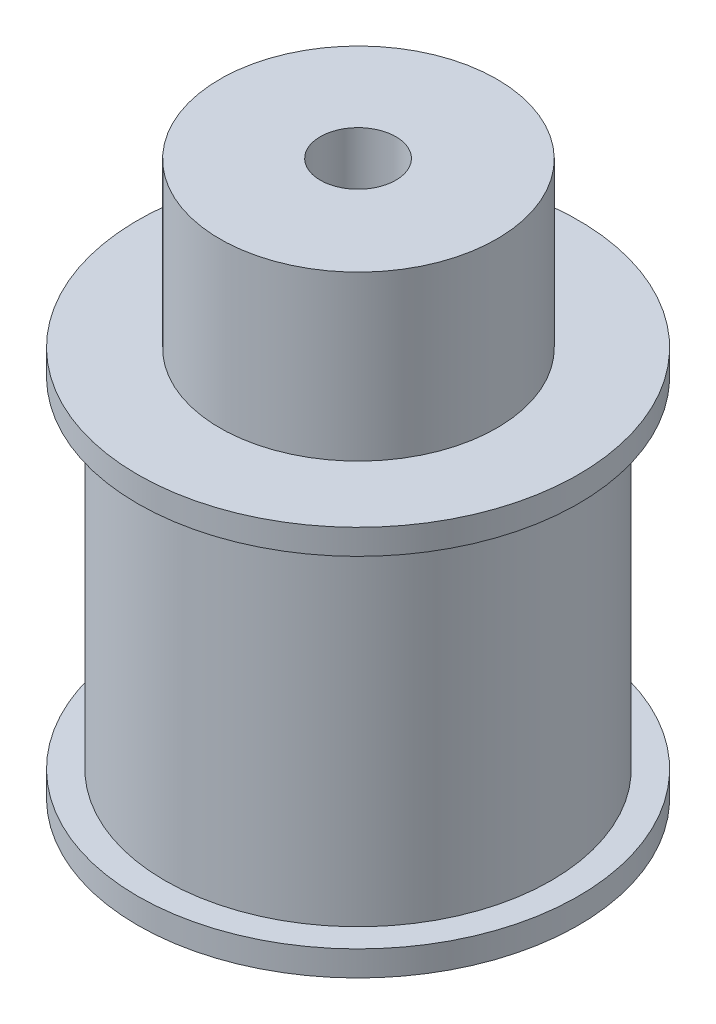
ISO-10303-21;
HEADER;
FILE_DESCRIPTION(('STEP AP214'),'2;1');
FILE_NAME('part.step','',(''),(''),'','','');
FILE_SCHEMA(('AUTOMOTIVE_DESIGN { 1 0 10303 214 1 1 1 1 }'));
ENDSEC;
DATA;
#1=APPLICATION_CONTEXT('core data for automotive mechanical design processes');
#2=APPLICATION_PROTOCOL_DEFINITION('international standard','automotive_design',2000,#1);
#3=PRODUCT_CONTEXT('',#1,'mechanical');
#4=PRODUCT('Part','Part','',(#3));
#5=PRODUCT_RELATED_PRODUCT_CATEGORY('part','',(#4));
#6=PRODUCT_DEFINITION_FORMATION('','',#4);
#7=PRODUCT_DEFINITION_CONTEXT('part definition',#1,'design');
#8=PRODUCT_DEFINITION('design','',#6,#7);
#9=PRODUCT_DEFINITION_SHAPE('','',#8);
#10=(LENGTH_UNIT() NAMED_UNIT(*) SI_UNIT(.MILLI.,.METRE.));
#11=(NAMED_UNIT(*) PLANE_ANGLE_UNIT() SI_UNIT($,.RADIAN.));
#12=(NAMED_UNIT(*) SI_UNIT($,.STERADIAN.) SOLID_ANGLE_UNIT());
#13=UNCERTAINTY_MEASURE_WITH_UNIT(LENGTH_MEASURE(1.E-05),#10,'distance_accuracy_value','');
#14=(GEOMETRIC_REPRESENTATION_CONTEXT(3) GLOBAL_UNCERTAINTY_ASSIGNED_CONTEXT((#13)) GLOBAL_UNIT_ASSIGNED_CONTEXT((#10,
#11,#12)) REPRESENTATION_CONTEXT('',''));
#15=CARTESIAN_POINT('',(0.,0.,0.));
#16=DIRECTION('',(0.,0.,1.));
#17=DIRECTION('',(1.,0.,0.));
#18=AXIS2_PLACEMENT_3D('',#15,#16,#17);
#19=CARTESIAN_POINT('',(0.,13.5,0.));
#20=DIRECTION('',(0.,-1.,0.));
#21=DIRECTION('',(0.,0.,-1.));
#22=AXIS2_PLACEMENT_3D('',#19,#20,#21);
#23=CYLINDRICAL_SURFACE('',#22,15.345);
#24=CARTESIAN_POINT('',(0.,13.5,0.));
#25=DIRECTION('',(0.,1.,0.));
#26=DIRECTION('',(0.,0.,1.));
#27=AXIS2_PLACEMENT_3D('',#24,#25,#26);
#28=CIRCLE('',#27,15.345);
#29=CARTESIAN_POINT('',(0.,13.5,15.345));
#30=VERTEX_POINT('',#29);
#31=EDGE_CURVE('E48',#30,#30,#28,.T.);
#32=ORIENTED_EDGE('',*,*,#31,.F.);
#33=EDGE_LOOP('',(#32));
#34=FACE_BOUND('',#33,.T.);
#35=CARTESIAN_POINT('',(0.,-13.5,0.));
#36=DIRECTION('',(0.,1.,0.));
#37=DIRECTION('',(0.,0.,1.));
#38=AXIS2_PLACEMENT_3D('',#35,#36,#37);
#39=CIRCLE('',#38,15.345);
#40=CARTESIAN_POINT('',(0.,-13.5,15.345));
#41=VERTEX_POINT('',#40);
#42=EDGE_CURVE('E44',#41,#41,#39,.T.);
#43=ORIENTED_EDGE('',*,*,#42,.T.);
#44=EDGE_LOOP('',(#43));
#45=FACE_BOUND('',#44,.T.);
#46=ADVANCED_FACE('F41',(#34,#45),#23,.T.);
#47=CARTESIAN_POINT('',(0.,15.5,0.));
#48=DIRECTION('',(0.,-1.,0.));
#49=DIRECTION('',(0.,0.,-1.));
#50=AXIS2_PLACEMENT_3D('',#47,#48,#49);
#51=CYLINDRICAL_SURFACE('',#50,17.5);
#52=CARTESIAN_POINT('',(0.,15.5,0.));
#53=DIRECTION('',(0.,1.,0.));
#54=DIRECTION('',(0.,0.,1.));
#55=AXIS2_PLACEMENT_3D('',#52,#53,#54);
#56=CIRCLE('',#55,17.5);
#57=CARTESIAN_POINT('',(0.,15.5,17.5));
#58=VERTEX_POINT('',#57);
#59=EDGE_CURVE('E53',#58,#58,#56,.T.);
#60=ORIENTED_EDGE('',*,*,#59,.F.);
#61=EDGE_LOOP('',(#60));
#62=FACE_BOUND('',#61,.T.);
#63=CARTESIAN_POINT('',(0.,13.5,0.));
#64=DIRECTION('',(0.,1.,0.));
#65=DIRECTION('',(0.,0.,1.));
#66=AXIS2_PLACEMENT_3D('',#63,#64,#65);
#67=CIRCLE('',#66,17.5);
#68=CARTESIAN_POINT('',(0.,13.5,17.5));
#69=VERTEX_POINT('',#68);
#70=EDGE_CURVE('E66',#69,#69,#67,.T.);
#71=ORIENTED_EDGE('',*,*,#70,.T.);
#72=EDGE_LOOP('',(#71));
#73=FACE_BOUND('',#72,.T.);
#74=ADVANCED_FACE('F98',(#62,#73),#51,.T.);
#75=CARTESIAN_POINT('',(0.,15.5,0.));
#76=DIRECTION('',(0.,1.,0.));
#77=DIRECTION('',(0.,0.,1.));
#78=AXIS2_PLACEMENT_3D('',#75,#76,#77);
#79=PLANE('',#78);
#80=CARTESIAN_POINT('',(0.0580145033387731,15.5,0.0291708459255628));
#81=DIRECTION('',(0.,1.,0.));
#82=DIRECTION('',(0.,0.,1.));
#83=AXIS2_PLACEMENT_3D('',#80,#81,#82);
#84=CIRCLE('',#83,11.);
#85=CARTESIAN_POINT('',(0.0580145033387731,15.5,-10.9708291540744));
#86=VERTEX_POINT('',#85);
#87=EDGE_CURVE('E10',#86,#86,#84,.T.);
#88=ORIENTED_EDGE('',*,*,#87,.F.);
#89=EDGE_LOOP('',(#88));
#90=FACE_BOUND('',#89,.T.);
#91=ORIENTED_EDGE('',*,*,#59,.T.);
#92=EDGE_LOOP('',(#91));
#93=FACE_BOUND('',#92,.T.);
#94=ADVANCED_FACE('F93',(#90,#93),#79,.T.);
#95=CARTESIAN_POINT('',(0.,13.5,0.));
#96=DIRECTION('',(0.,1.,0.));
#97=DIRECTION('',(0.,0.,1.));
#98=AXIS2_PLACEMENT_3D('',#95,#96,#97);
#99=PLANE('',#98);
#100=ORIENTED_EDGE('',*,*,#31,.T.);
#101=EDGE_LOOP('',(#100));
#102=FACE_BOUND('',#101,.T.);
#103=ORIENTED_EDGE('',*,*,#70,.F.);
#104=EDGE_LOOP('',(#103));
#105=FACE_BOUND('',#104,.T.);
#106=ADVANCED_FACE('F84',(#102,#105),#99,.F.);
#107=CARTESIAN_POINT('',(0.,-15.5,0.));
#108=DIRECTION('',(0.,1.,0.));
#109=DIRECTION('',(0.,0.,1.));
#110=AXIS2_PLACEMENT_3D('',#107,#108,#109);
#111=CYLINDRICAL_SURFACE('',#110,17.5);
#112=CARTESIAN_POINT('',(0.,-15.5,0.));
#113=DIRECTION('',(0.,1.,0.));
#114=DIRECTION('',(0.,0.,1.));
#115=AXIS2_PLACEMENT_3D('',#112,#113,#114);
#116=CIRCLE('',#115,17.5);
#117=CARTESIAN_POINT('',(0.,-15.5,17.5));
#118=VERTEX_POINT('',#117);
#119=EDGE_CURVE('E58',#118,#118,#116,.T.);
#120=ORIENTED_EDGE('',*,*,#119,.T.);
#121=EDGE_LOOP('',(#120));
#122=FACE_BOUND('',#121,.T.);
#123=CARTESIAN_POINT('',(0.,-13.5,0.));
#124=DIRECTION('',(0.,1.,0.));
#125=DIRECTION('',(0.,0.,1.));
#126=AXIS2_PLACEMENT_3D('',#123,#124,#125);
#127=CIRCLE('',#126,17.5);
#128=CARTESIAN_POINT('',(0.,-13.5,17.5));
#129=VERTEX_POINT('',#128);
#130=EDGE_CURVE('E61',#129,#129,#127,.T.);
#131=ORIENTED_EDGE('',*,*,#130,.F.);
#132=EDGE_LOOP('',(#131));
#133=FACE_BOUND('',#132,.T.);
#134=ADVANCED_FACE('F82',(#122,#133),#111,.T.);
#135=CARTESIAN_POINT('',(0.,-15.5,0.));
#136=DIRECTION('',(0.,-1.,0.));
#137=DIRECTION('',(0.,0.,1.));
#138=AXIS2_PLACEMENT_3D('',#135,#136,#137);
#139=PLANE('',#138);
#140=CARTESIAN_POINT('',(0.,-15.5,0.));
#141=DIRECTION('',(0.,1.,0.));
#142=DIRECTION('',(0.,0.,1.));
#143=AXIS2_PLACEMENT_3D('',#140,#141,#142);
#144=CIRCLE('',#143,3.);
#145=CARTESIAN_POINT('',(0.,-15.5,3.));
#146=VERTEX_POINT('',#145);
#147=EDGE_CURVE('E183',#146,#146,#144,.T.);
#148=ORIENTED_EDGE('',*,*,#147,.T.);
#149=EDGE_LOOP('',(#148));
#150=FACE_BOUND('',#149,.T.);
#151=ORIENTED_EDGE('',*,*,#119,.F.);
#152=EDGE_LOOP('',(#151));
#153=FACE_BOUND('',#152,.T.);
#154=ADVANCED_FACE('F78',(#150,#153),#139,.T.);
#155=CARTESIAN_POINT('',(0.,-13.5,0.));
#156=DIRECTION('',(0.,-1.,0.));
#157=DIRECTION('',(0.,0.,1.));
#158=AXIS2_PLACEMENT_3D('',#155,#156,#157);
#159=PLANE('',#158);
#160=ORIENTED_EDGE('',*,*,#42,.F.);
#161=EDGE_LOOP('',(#160));
#162=FACE_BOUND('',#161,.T.);
#163=ORIENTED_EDGE('',*,*,#130,.T.);
#164=EDGE_LOOP('',(#163));
#165=FACE_BOUND('',#164,.T.);
#166=ADVANCED_FACE('F74',(#162,#165),#159,.F.);
#167=CARTESIAN_POINT('',(0.0580145033387731,28.5,0.0291708459255628));
#168=DIRECTION('',(0.,-1.,0.));
#169=DIRECTION('',(0.,0.,-1.));
#170=AXIS2_PLACEMENT_3D('',#167,#168,#169);
#171=CYLINDRICAL_SURFACE('',#170,11.);
#172=CARTESIAN_POINT('',(0.0580145033387731,28.5,0.0291708459255628));
#173=DIRECTION('',(0.,1.,0.));
#174=DIRECTION('',(0.,0.,1.));
#175=AXIS2_PLACEMENT_3D('',#172,#173,#174);
#176=CIRCLE('',#175,11.);
#177=CARTESIAN_POINT('',(0.0580145033387731,28.5,-10.9708291540744));
#178=VERTEX_POINT('',#177);
#179=EDGE_CURVE('E56',#178,#178,#176,.T.);
#180=CARTESIAN_POINT('',(0.0580145033387731,28.5,-10.9708291540744));
#181=CARTESIAN_POINT('',(0.0580145033387731,28.3645833333333,-10.9708291540744));
#182=CARTESIAN_POINT('',(0.0580145033387731,28.2291666666667,-10.9708291540744));
#183=CARTESIAN_POINT('',(0.0580145033387731,27.9583333333333,-10.9708291540744));
#184=CARTESIAN_POINT('',(0.0580145033387731,27.8229166666667,-10.9708291540744));
#185=CARTESIAN_POINT('',(0.0580145033387731,27.5520833333333,-10.9708291540744));
#186=CARTESIAN_POINT('',(0.0580145033387731,27.4166666666667,-10.9708291540744));
#187=CARTESIAN_POINT('',(0.0580145033387731,27.1458333333333,-10.9708291540744));
#188=CARTESIAN_POINT('',(0.0580145033387731,27.0104166666667,-10.9708291540744));
#189=CARTESIAN_POINT('',(0.0580145033387731,26.7395833333333,-10.9708291540744));
#190=CARTESIAN_POINT('',(0.0580145033387731,26.6041666666667,-10.9708291540744));
#191=CARTESIAN_POINT('',(0.0580145033387731,26.3333333333333,-10.9708291540744));
#192=CARTESIAN_POINT('',(0.0580145033387731,26.1979166666667,-10.9708291540744));
#193=CARTESIAN_POINT('',(0.0580145033387731,25.9270833333333,-10.9708291540744));
#194=CARTESIAN_POINT('',(0.0580145033387731,25.7916666666667,-10.9708291540744));
#195=CARTESIAN_POINT('',(0.0580145033387731,25.5208333333333,-10.9708291540744));
#196=CARTESIAN_POINT('',(0.0580145033387731,25.3854166666667,-10.9708291540744));
#197=CARTESIAN_POINT('',(0.0580145033387731,25.1145833333333,-10.9708291540744));
#198=CARTESIAN_POINT('',(0.0580145033387731,24.9791666666667,-10.9708291540744));
#199=CARTESIAN_POINT('',(0.0580145033387731,24.7083333333333,-10.9708291540744));
#200=CARTESIAN_POINT('',(0.0580145033387731,24.5729166666667,-10.9708291540744));
#201=CARTESIAN_POINT('',(0.0580145033387731,24.3020833333333,-10.9708291540744));
#202=CARTESIAN_POINT('',(0.0580145033387731,24.1666666666667,-10.9708291540744));
#203=CARTESIAN_POINT('',(0.0580145033387731,23.8958333333333,-10.9708291540744));
#204=CARTESIAN_POINT('',(0.0580145033387731,23.7604166666667,-10.9708291540744));
#205=CARTESIAN_POINT('',(0.0580145033387731,23.4895833333333,-10.9708291540744));
#206=CARTESIAN_POINT('',(0.0580145033387731,23.3541666666667,-10.9708291540744));
#207=CARTESIAN_POINT('',(0.0580145033387731,23.0833333333333,-10.9708291540744));
#208=CARTESIAN_POINT('',(0.0580145033387731,22.9479166666667,-10.9708291540744));
#209=CARTESIAN_POINT('',(0.0580145033387731,22.6770833333333,-10.9708291540744));
#210=CARTESIAN_POINT('',(0.0580145033387731,22.5416666666667,-10.9708291540744));
#211=CARTESIAN_POINT('',(0.0580145033387731,22.2708333333333,-10.9708291540744));
#212=CARTESIAN_POINT('',(0.0580145033387731,22.1354166666667,-10.9708291540744));
#213=CARTESIAN_POINT('',(0.0580145033387731,21.8645833333333,-10.9708291540744));
#214=CARTESIAN_POINT('',(0.0580145033387731,21.7291666666667,-10.9708291540744));
#215=CARTESIAN_POINT('',(0.0580145033387731,21.4583333333333,-10.9708291540744));
#216=CARTESIAN_POINT('',(0.0580145033387731,21.3229166666667,-10.9708291540744));
#217=CARTESIAN_POINT('',(0.0580145033387731,21.0520833333333,-10.9708291540744));
#218=CARTESIAN_POINT('',(0.0580145033387731,20.9166666666667,-10.9708291540744));
#219=CARTESIAN_POINT('',(0.0580145033387731,20.6458333333333,-10.9708291540744));
#220=CARTESIAN_POINT('',(0.0580145033387731,20.5104166666667,-10.9708291540744));
#221=CARTESIAN_POINT('',(0.0580145033387731,20.2395833333333,-10.9708291540744));
#222=CARTESIAN_POINT('',(0.0580145033387731,20.1041666666667,-10.9708291540744));
#223=CARTESIAN_POINT('',(0.0580145033387731,19.8333333333333,-10.9708291540744));
#224=CARTESIAN_POINT('',(0.0580145033387731,19.6979166666667,-10.9708291540744));
#225=CARTESIAN_POINT('',(0.0580145033387731,19.4270833333333,-10.9708291540744));
#226=CARTESIAN_POINT('',(0.0580145033387731,19.2916666666667,-10.9708291540744));
#227=CARTESIAN_POINT('',(0.0580145033387731,19.0208333333333,-10.9708291540744));
#228=CARTESIAN_POINT('',(0.0580145033387731,18.8854166666667,-10.9708291540744));
#229=CARTESIAN_POINT('',(0.0580145033387731,18.6145833333333,-10.9708291540744));
#230=CARTESIAN_POINT('',(0.0580145033387731,18.4791666666667,-10.9708291540744));
#231=CARTESIAN_POINT('',(0.0580145033387731,18.2083333333333,-10.9708291540744));
#232=CARTESIAN_POINT('',(0.0580145033387731,18.0729166666667,-10.9708291540744));
#233=CARTESIAN_POINT('',(0.0580145033387731,17.8020833333333,-10.9708291540744));
#234=CARTESIAN_POINT('',(0.0580145033387731,17.6666666666667,-10.9708291540744));
#235=CARTESIAN_POINT('',(0.0580145033387731,17.3958333333333,-10.9708291540744));
#236=CARTESIAN_POINT('',(0.0580145033387731,17.2604166666667,-10.9708291540744));
#237=CARTESIAN_POINT('',(0.0580145033387731,16.9895833333333,-10.9708291540744));
#238=CARTESIAN_POINT('',(0.0580145033387731,16.8541666666667,-10.9708291540744));
#239=CARTESIAN_POINT('',(0.0580145033387731,16.5833333333333,-10.9708291540744));
#240=CARTESIAN_POINT('',(0.0580145033387731,16.4479166666667,-10.9708291540744));
#241=CARTESIAN_POINT('',(0.0580145033387731,16.1770833333333,-10.9708291540744));
#242=CARTESIAN_POINT('',(0.0580145033387731,16.0416666666667,-10.9708291540744));
#243=CARTESIAN_POINT('',(0.0580145033387731,15.7708333333333,-10.9708291540744));
#244=CARTESIAN_POINT('',(0.0580145033387731,15.6354166666667,-10.9708291540744));
#245=CARTESIAN_POINT('',(0.0580145033387731,15.5,-10.9708291540744));
#246=B_SPLINE_CURVE_WITH_KNOTS('',3,(#180,#181,#182,#183,#184,#185,#186,#187,#188,#189,#190,
#191,#192,#193,#194,#195,#196,#197,#198,#199,#200,#201,#202,#203,#204,#205,#206,#207,#208,#209,
#210,#211,#212,#213,#214,#215,#216,#217,#218,#219,#220,#221,#222,#223,#224,#225,#226,#227,#228,
#229,#230,#231,#232,#233,#234,#235,#236,#237,#238,#239,#240,#241,#242,#243,#244,#245),
.UNSPECIFIED.,.F.,.F.,(4,2,2,2,2,2,2,2,2,2,2,2,2,2,2,2,2,2,2,2,2,2,2,2,2,2,2,2,2,2,2,2,4),(0.,
0.406249999999997,0.812499999999997,1.21875,1.625,2.03125,2.4375,2.84375,3.25,3.65625,4.0625,
4.46875,4.875,5.28125,5.6875,6.09375,6.5,6.90625,7.3125,7.71875,8.125,8.53124999999999,8.9375,
9.34374999999999,9.75,10.15625,10.5625,10.96875,11.375,11.78125,12.1875,12.59375,13.),.UNSPECIFIED.);
#247=EDGE_CURVE('BSEAM77',#178,#86,#246,.T.);
#248=ORIENTED_EDGE('',*,*,#179,.F.);
#249=ORIENTED_EDGE('',*,*,#87,.T.);
#250=ORIENTED_EDGE('',*,*,#247,.T.);
#251=ORIENTED_EDGE('',*,*,#247,.F.);
#252=EDGE_LOOP('',(#248,#250,#249,#251));
#253=FACE_BOUND('',#252,.T.);
#254=ADVANCED_FACE('F77',(#253),#171,.T.);
#255=CARTESIAN_POINT('',(0.0580145033387731,28.5,0.0291708459255628));
#256=DIRECTION('',(0.,1.,0.));
#257=DIRECTION('',(0.,0.,1.));
#258=AXIS2_PLACEMENT_3D('',#255,#256,#257);
#259=PLANE('',#258);
#260=CARTESIAN_POINT('',(0.,28.5,0.));
#261=DIRECTION('',(0.,1.,0.));
#262=DIRECTION('',(0.,0.,1.));
#263=AXIS2_PLACEMENT_3D('',#260,#261,#262);
#264=CIRCLE('',#263,3.);
#265=CARTESIAN_POINT('',(0.,28.5,3.));
#266=VERTEX_POINT('',#265);
#267=EDGE_CURVE('E180',#266,#266,#264,.T.);
#268=ORIENTED_EDGE('',*,*,#267,.F.);
#269=EDGE_LOOP('',(#268));
#270=FACE_BOUND('',#269,.T.);
#271=ORIENTED_EDGE('',*,*,#179,.T.);
#272=EDGE_LOOP('',(#271));
#273=FACE_BOUND('',#272,.T.);
#274=ADVANCED_FACE('F123',(#270,#273),#259,.T.);
#275=CARTESIAN_POINT('',(0.,28.5,0.));
#276=DIRECTION('',(0.,-1.,0.));
#277=DIRECTION('',(0.,0.,-1.));
#278=AXIS2_PLACEMENT_3D('',#275,#276,#277);
#279=CYLINDRICAL_SURFACE('',#278,3.);
#280=ORIENTED_EDGE('',*,*,#267,.T.);
#281=EDGE_LOOP('',(#280));
#282=FACE_BOUND('',#281,.T.);
#283=ORIENTED_EDGE('',*,*,#147,.F.);
#284=EDGE_LOOP('',(#283));
#285=FACE_BOUND('',#284,.T.);
#286=ADVANCED_FACE('F138',(#282,#285),#279,.F.);
#287=CLOSED_SHELL('',(#46,#74,#94,#106,#134,#154,#166,#254,#274,#286));
#288=MANIFOLD_SOLID_BREP('B2',#287);
#289=ADVANCED_BREP_SHAPE_REPRESENTATION('',(#18,#288),#14);
#290=SHAPE_DEFINITION_REPRESENTATION(#9,#289);
ENDSEC;
END-ISO-10303-21;
